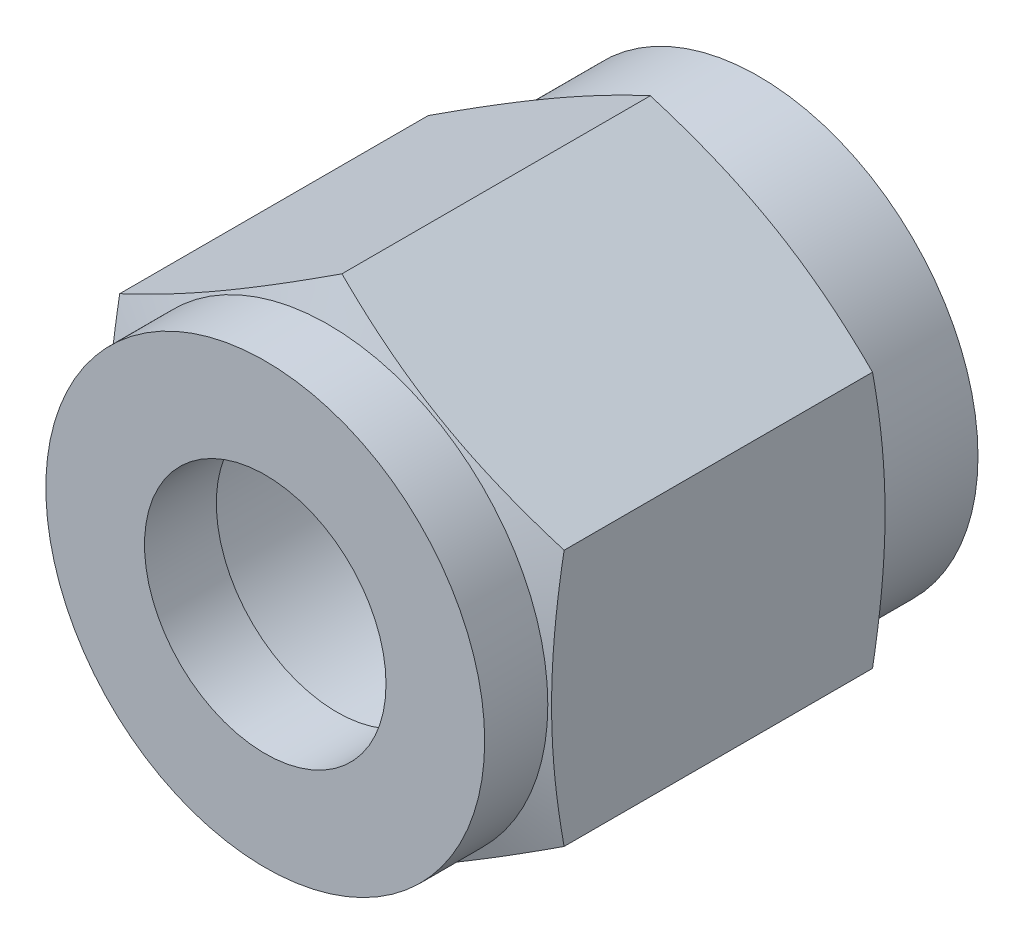
ISO-10303-21;
HEADER;
FILE_DESCRIPTION(('STEP AP214'),'2;1');
FILE_NAME('part.step','',(''),(''),'','','');
FILE_SCHEMA(('AUTOMOTIVE_DESIGN { 1 0 10303 214 1 1 1 1 }'));
ENDSEC;
DATA;
#1=APPLICATION_CONTEXT('core data for automotive mechanical design processes');
#2=APPLICATION_PROTOCOL_DEFINITION('international standard','automotive_design',2000,#1);
#3=PRODUCT_CONTEXT('',#1,'mechanical');
#4=PRODUCT('Part','Part','',(#3));
#5=PRODUCT_RELATED_PRODUCT_CATEGORY('part','',(#4));
#6=PRODUCT_DEFINITION_FORMATION('','',#4);
#7=PRODUCT_DEFINITION_CONTEXT('part definition',#1,'design');
#8=PRODUCT_DEFINITION('design','',#6,#7);
#9=PRODUCT_DEFINITION_SHAPE('','',#8);
#10=(LENGTH_UNIT() NAMED_UNIT(*) SI_UNIT(.MILLI.,.METRE.));
#11=(NAMED_UNIT(*) PLANE_ANGLE_UNIT() SI_UNIT($,.RADIAN.));
#12=(NAMED_UNIT(*) SI_UNIT($,.STERADIAN.) SOLID_ANGLE_UNIT());
#13=UNCERTAINTY_MEASURE_WITH_UNIT(LENGTH_MEASURE(1.E-05),#10,'distance_accuracy_value','');
#14=(GEOMETRIC_REPRESENTATION_CONTEXT(3) GLOBAL_UNCERTAINTY_ASSIGNED_CONTEXT((#13)) GLOBAL_UNIT_ASSIGNED_CONTEXT((#10,
#11,#12)) REPRESENTATION_CONTEXT('',''));
#15=CARTESIAN_POINT('',(0.,0.,0.));
#16=DIRECTION('',(0.,0.,1.));
#17=DIRECTION('',(1.,0.,0.));
#18=AXIS2_PLACEMENT_3D('',#15,#16,#17);
#19=CARTESIAN_POINT('',(0.,3.8862,15.875));
#20=DIRECTION('',(0.,0.,-1.));
#21=DIRECTION('',(-1.,0.,0.));
#22=AXIS2_PLACEMENT_3D('',#19,#20,#21);
#23=PLANE('',#22);
#24=CARTESIAN_POINT('',(0.,0.,15.875));
#25=DIRECTION('',(0.,0.,1.));
#26=DIRECTION('',(1.,0.,0.));
#27=AXIS2_PLACEMENT_3D('',#24,#25,#26);
#28=CIRCLE('',#27,3.8862);
#29=CARTESIAN_POINT('',(3.8862,0.,15.875));
#30=VERTEX_POINT('',#29);
#31=EDGE_CURVE('E199',#30,#30,#28,.T.);
#32=ORIENTED_EDGE('',*,*,#31,.F.);
#33=EDGE_LOOP('',(#32));
#34=FACE_BOUND('',#33,.T.);
#35=CARTESIAN_POINT('',(0.,0.,15.875));
#36=DIRECTION('',(0.,0.,1.));
#37=DIRECTION('',(1.,0.,0.));
#38=AXIS2_PLACEMENT_3D('',#35,#36,#37);
#39=CIRCLE('',#38,7.0612);
#40=CARTESIAN_POINT('',(7.0612,0.,15.875));
#41=VERTEX_POINT('',#40);
#42=EDGE_CURVE('E219',#41,#41,#39,.T.);
#43=ORIENTED_EDGE('',*,*,#42,.T.);
#44=EDGE_LOOP('',(#43));
#45=FACE_BOUND('',#44,.T.);
#46=ADVANCED_FACE('F35',(#34,#45),#23,.F.);
#47=CARTESIAN_POINT('',(0.,0.,-2.00199408661353));
#48=DIRECTION('',(0.,0.,1.));
#49=DIRECTION('',(1.,0.,0.));
#50=AXIS2_PLACEMENT_3D('',#47,#48,#49);
#51=CYLINDRICAL_SURFACE('',#50,7.0612);
#52=ORIENTED_EDGE('',*,*,#42,.F.);
#53=EDGE_LOOP('',(#52));
#54=FACE_BOUND('',#53,.T.);
#55=CARTESIAN_POINT('',(0.,0.,13.843));
#56=DIRECTION('',(0.,0.,1.));
#57=DIRECTION('',(1.,0.,0.));
#58=AXIS2_PLACEMENT_3D('',#55,#56,#57);
#59=CIRCLE('',#58,7.0612);
#60=CARTESIAN_POINT('',(7.0612,0.,13.843));
#61=VERTEX_POINT('',#60);
#62=EDGE_CURVE('E217',#61,#61,#59,.T.);
#63=ORIENTED_EDGE('',*,*,#62,.T.);
#64=EDGE_LOOP('',(#63));
#65=FACE_BOUND('',#64,.T.);
#66=ADVANCED_FACE('F246',(#54,#65),#51,.T.);
#67=CARTESIAN_POINT('',(0.,0.,12.9185156049638));
#68=DIRECTION('',(0.,0.,-1.));
#69=DIRECTION('',(-1.,0.,0.));
#70=AXIS2_PLACEMENT_3D('',#67,#68,#69);
#71=CONICAL_SURFACE('',#70,9.6012,1.22173047639603);
#72=CARTESIAN_POINT('',(7.1501,-10.9733942408285,11.6460386591749));
#73=CARTESIAN_POINT('',(7.1501,-10.6494131631028,11.744808436719));
#74=CARTESIAN_POINT('',(7.1501,-10.325077202807,11.8424352186267));
#75=CARTESIAN_POINT('',(7.1501,-9.67551472139027,12.0347705406337));
#76=CARTESIAN_POINT('',(7.1501,-9.35028813290628,12.129478852961));
#77=CARTESIAN_POINT('',(7.1501,-8.69821796772036,12.3154994404002));
#78=CARTESIAN_POINT('',(7.1501,-8.37137252117667,12.4068051844316));
#79=CARTESIAN_POINT('',(7.1501,-7.71647177269753,12.5849632056731));
#80=CARTESIAN_POINT('',(7.1501,-7.38841649230386,12.6718155617718));
#81=CARTESIAN_POINT('',(7.1501,-6.73492094013619,12.8389290922431));
#82=CARTESIAN_POINT('',(7.1501,-6.40949812330909,12.919258188514));
#83=CARTESIAN_POINT('',(7.1501,-5.7570381913487,13.0731429420443));
#84=CARTESIAN_POINT('',(7.1501,-5.43000104928173,13.1466984858874));
#85=CARTESIAN_POINT('',(7.1501,-4.77423019198395,13.2853358746407));
#86=CARTESIAN_POINT('',(7.1501,-4.44549705607634,13.3504204365588));
#87=CARTESIAN_POINT('',(7.1501,-3.78612022718696,13.4701461060986));
#88=CARTESIAN_POINT('',(7.1501,-3.45547659752591,13.5247875578208));
#89=CARTESIAN_POINT('',(7.1501,-2.82941436881223,13.6160140456905));
#90=CARTESIAN_POINT('',(7.1501,-2.53419227767363,13.6539350946488));
#91=CARTESIAN_POINT('',(7.1501,-1.94248658759804,13.7182724007931));
#92=CARTESIAN_POINT('',(7.1501,-1.64600302551776,13.7446889918084));
#93=CARTESIAN_POINT('',(7.1501,-1.05237677291001,13.7847459371043));
#94=CARTESIAN_POINT('',(7.1501,-0.755234718997437,13.7983955742554));
#95=CARTESIAN_POINT('',(7.1501,-0.160634054487782,13.8122266296512));
#96=CARTESIAN_POINT('',(7.1501,0.136824553620815,13.812408153));
#97=CARTESIAN_POINT('',(7.1501,0.732958138886146,13.799259319847));
#98=CARTESIAN_POINT('',(7.1501,1.03163156831226,13.7858599417533));
#99=CARTESIAN_POINT('',(7.1501,1.62811277408338,13.7461643986606));
#100=CARTESIAN_POINT('',(7.1501,1.9259205292876,13.7198679213172));
#101=CARTESIAN_POINT('',(7.1501,2.52052035822284,13.6556174521548));
#102=CARTESIAN_POINT('',(7.1501,2.8173113189939,13.6176533086444));
#103=CARTESIAN_POINT('',(7.1501,3.40940808663049,13.5316204835804));
#104=CARTESIAN_POINT('',(7.1501,3.7047138864032,13.4835517538162));
#105=CARTESIAN_POINT('',(7.1501,4.31312291771623,13.3754547496146));
#106=CARTESIAN_POINT('',(7.1501,4.62612259339509,13.3148487158894));
#107=CARTESIAN_POINT('',(7.1501,5.2504916881829,13.185703525963));
#108=CARTESIAN_POINT('',(7.1501,5.56186097646994,13.1171637430545));
#109=CARTESIAN_POINT('',(7.1501,6.18319904560609,12.9736301907073));
#110=CARTESIAN_POINT('',(7.1501,6.49316737054438,12.8986344600215));
#111=CARTESIAN_POINT('',(7.1501,7.11178340057605,12.743438051136));
#112=CARTESIAN_POINT('',(7.1501,7.42043113872977,12.6632375040589));
#113=CARTESIAN_POINT('',(7.1501,8.03700685953119,12.4985078030037));
#114=CARTESIAN_POINT('',(7.1501,8.3449333306404,12.4139730117113));
#115=CARTESIAN_POINT('',(7.1501,8.95981983595927,12.241452414998));
#116=CARTESIAN_POINT('',(7.1501,9.26677985561915,12.1534665578876));
#117=CARTESIAN_POINT('',(7.1501,10.1863158594963,11.885334346692));
#118=CARTESIAN_POINT('',(7.1501,10.7976644158551,11.7009816487472));
#119=CARTESIAN_POINT('',(7.1501,12.0112070605424,11.3267084330905));
#120=CARTESIAN_POINT('',(7.1501,12.6134274343107,11.1368724429872));
#121=CARTESIAN_POINT('',(7.1501,13.8161846275291,10.7518485838213));
#122=CARTESIAN_POINT('',(7.1501,14.4167213609373,10.5566604465432));
#123=CARTESIAN_POINT('',(7.1501,15.6141650513847,10.163153877372));
#124=CARTESIAN_POINT('',(7.1501,16.2110770212311,9.96485066266263));
#125=CARTESIAN_POINT('',(7.1501,17.1056879229171,9.66522189183673));
#126=CARTESIAN_POINT('',(7.1501,17.4037530959653,9.56498749155974));
#127=CARTESIAN_POINT('',(7.1501,17.9996665625431,9.36387831124216));
#128=CARTESIAN_POINT('',(7.1501,18.2975148565927,9.26300353274239));
#129=CARTESIAN_POINT('',(7.1501,18.5952690417214,9.16185177243029));
#130=B_SPLINE_CURVE_WITH_KNOTS('',3,(#72,#73,#74,#75,#76,#77,#78,#79,#80,#81,#82,#83,#84,#85,
#86,#87,#88,#89,#90,#91,#92,#93,#94,#95,#96,#97,#98,#99,#100,#101,#102,#103,#104,#105,#106,#107,
#108,#109,#110,#111,#112,#113,#114,#115,#116,#117,#118,#119,#120,#121,#122,#123,#124,#125,#126,
#127,#128,#129),.UNSPECIFIED.,.F.,.F.,(4,2,2,2,2,2,2,2,2,2,2,2,2,2,2,2,2,2,2,2,2,2,2,2,2,2,2,2,
4),(0.,1.01611381773726,2.03230673822492,3.05035906464442,4.06839335073972,5.07390804185603,
6.07943956623543,7.08464777445708,8.08982285536477,8.98257076191834,9.87529276153749,
10.7673651559618,11.6594305887146,12.5560525711153,13.4526962691479,14.3501223296068,
15.2475526719262,16.2038655914498,17.1602541042189,18.1169341897593,19.0735901834087,
20.0315236753987,20.9894715206372,22.9050046958671,24.7992733285772,26.6936370640948,
28.5805964102331,29.5239982193797,30.4673977594761),.UNSPECIFIED.);
#131=CARTESIAN_POINT('',(7.1501,-4.12811215973275,13.4080467184903));
#132=VERTEX_POINT('',#131);
#133=CARTESIAN_POINT('',(7.1501,4.12811215973275,13.4080467184903));
#134=VERTEX_POINT('',#133);
#135=EDGE_CURVE('E89',#132,#134,#130,.T.);
#136=ORIENTED_EDGE('',*,*,#135,.T.);
#137=CARTESIAN_POINT('',(7.1503,4.12799668967891,13.4080046899461));
#138=CARTESIAN_POINT('',(6.85418215778212,4.29896040559525,13.4702534607761));
#139=CARTESIAN_POINT('',(6.55708785067137,4.47048788378035,13.5268794761757));
#140=CARTESIAN_POINT('',(5.96096751027156,4.81465812277959,13.6265041708364));
#141=CARTESIAN_POINT('',(5.66194015103077,4.98730164913233,13.6694921867209));
#142=CARTESIAN_POINT('',(5.06527220336609,5.33178804933335,13.7390240642547));
#143=CARTESIAN_POINT('',(4.76764524127366,5.5036230560155,13.765719584696));
#144=CARTESIAN_POINT('',(4.1716953174409,5.84769490496389,13.8015257787858));
#145=CARTESIAN_POINT('',(3.87337265872045,6.0199315722815,13.8106430461737));
#146=CARTESIAN_POINT('',(3.27672734127955,6.36440490691673,13.8106430461737));
#147=CARTESIAN_POINT('',(2.9784046825591,6.53664157423435,13.8015257787858));
#148=CARTESIAN_POINT('',(2.38245475872634,6.88071342318273,13.765719584696));
#149=CARTESIAN_POINT('',(2.08482779663391,7.05254842986489,13.7390240642547));
#150=CARTESIAN_POINT('',(1.48815984896924,7.39703483006591,13.6694921867209));
#151=CARTESIAN_POINT('',(1.18913248972844,7.56967835641865,13.6265041708364));
#152=CARTESIAN_POINT('',(0.593012149328629,7.91384859541789,13.5268794761757));
#153=CARTESIAN_POINT('',(0.295917842217877,8.08537607360299,13.4702534607761));
#154=CARTESIAN_POINT('',(-0.000199999999998395,8.25633978951933,13.4080046899461));
#155=B_SPLINE_CURVE_WITH_KNOTS('',3,(#137,#138,#139,#140,#141,#142,#143,#144,#145,#146,#147,
#148,#149,#150,#151,#152,#153,#154),.UNSPECIFIED.,.F.,.F.,(4,2,2,2,2,2,2,2,4),(0.,
1.04275010680278,2.08631352850125,3.12000856829615,4.15331578554575,5.18662300279535,
6.22031804259025,7.26388146428872,8.3066315710915),.UNSPECIFIED.);
#156=CARTESIAN_POINT('',(0.,8.25622431946549,13.4080467184903));
#157=VERTEX_POINT('',#156);
#158=EDGE_CURVE('E191',#134,#157,#155,.T.);
#159=ORIENTED_EDGE('',*,*,#158,.T.);
#160=CARTESIAN_POINT('',(0.000200000000000909,8.25633978951933,13.4080046899461));
#161=CARTESIAN_POINT('',(-0.295917842217876,8.08537607360299,13.4702534607761));
#162=CARTESIAN_POINT('',(-0.593012149328627,7.91384859541789,13.5268794761757));
#163=CARTESIAN_POINT('',(-1.18913248972844,7.56967835641865,13.6265041708364));
#164=CARTESIAN_POINT('',(-1.48815984896923,7.39703483006591,13.6694921867209));
#165=CARTESIAN_POINT('',(-2.08482779663391,7.05254842986489,13.7390240642547));
#166=CARTESIAN_POINT('',(-2.38245475872634,6.88071342318273,13.765719584696));
#167=CARTESIAN_POINT('',(-2.9784046825591,6.53664157423435,13.8015257787858));
#168=CARTESIAN_POINT('',(-3.27672734127955,6.36440490691673,13.8106430461737));
#169=CARTESIAN_POINT('',(-3.87337265872045,6.0199315722815,13.8106430461737));
#170=CARTESIAN_POINT('',(-4.1716953174409,5.84769490496389,13.8015257787858));
#171=CARTESIAN_POINT('',(-4.76764524127366,5.5036230560155,13.765719584696));
#172=CARTESIAN_POINT('',(-5.06527220336609,5.33178804933335,13.7390240642547));
#173=CARTESIAN_POINT('',(-5.66194015103077,4.98730164913233,13.6694921867209));
#174=CARTESIAN_POINT('',(-5.96096751027156,4.81465812277959,13.6265041708364));
#175=CARTESIAN_POINT('',(-6.55708785067137,4.47048788378035,13.5268794761757));
#176=CARTESIAN_POINT('',(-6.85418215778213,4.29896040559525,13.4702534607761));
#177=CARTESIAN_POINT('',(-7.1503,4.12799668967891,13.4080046899461));
#178=B_SPLINE_CURVE_WITH_KNOTS('',3,(#160,#161,#162,#163,#164,#165,#166,#167,#168,#169,#170,
#171,#172,#173,#174,#175,#176,#177),.UNSPECIFIED.,.F.,.F.,(4,2,2,2,2,2,2,2,4),(0.,
1.04275010680278,2.08631352850125,3.12000856829615,4.15331578554575,5.18662300279536,
6.22031804259025,7.26388146428873,8.3066315710915),.UNSPECIFIED.);
#179=CARTESIAN_POINT('',(-7.1501,4.12811215973275,13.4080467184903));
#180=VERTEX_POINT('',#179);
#181=EDGE_CURVE('E185',#157,#180,#178,.T.);
#182=ORIENTED_EDGE('',*,*,#181,.T.);
#183=CARTESIAN_POINT('',(-7.1501,-10.9733942408285,11.6460386591749));
#184=CARTESIAN_POINT('',(-7.1501,-10.6494131631028,11.744808436719));
#185=CARTESIAN_POINT('',(-7.1501,-10.325077202807,11.8424352186267));
#186=CARTESIAN_POINT('',(-7.1501,-9.67551472139026,12.0347705406337));
#187=CARTESIAN_POINT('',(-7.1501,-9.35028813290628,12.129478852961));
#188=CARTESIAN_POINT('',(-7.1501,-8.69821796772036,12.3154994404002));
#189=CARTESIAN_POINT('',(-7.1501,-8.37137252117667,12.4068051844316));
#190=CARTESIAN_POINT('',(-7.1501,-7.71647177269753,12.5849632056731));
#191=CARTESIAN_POINT('',(-7.1501,-7.38841649230386,12.6718155617718));
#192=CARTESIAN_POINT('',(-7.1501,-6.73492094013619,12.8389290922431));
#193=CARTESIAN_POINT('',(-7.1501,-6.40949812330909,12.919258188514));
#194=CARTESIAN_POINT('',(-7.1501,-5.7570381913487,13.0731429420443));
#195=CARTESIAN_POINT('',(-7.1501,-5.43000104928173,13.1466984858874));
#196=CARTESIAN_POINT('',(-7.1501,-4.77423019198395,13.2853358746407));
#197=CARTESIAN_POINT('',(-7.1501,-4.44549705607634,13.3504204365588));
#198=CARTESIAN_POINT('',(-7.1501,-3.78612022718695,13.4701461060986));
#199=CARTESIAN_POINT('',(-7.1501,-3.45547659752591,13.5247875578208));
#200=CARTESIAN_POINT('',(-7.1501,-2.82941436881223,13.6160140456905));
#201=CARTESIAN_POINT('',(-7.1501,-2.53419227767363,13.6539350946488));
#202=CARTESIAN_POINT('',(-7.1501,-1.94248658759804,13.7182724007931));
#203=CARTESIAN_POINT('',(-7.1501,-1.64600302551776,13.7446889918084));
#204=CARTESIAN_POINT('',(-7.1501,-1.05237677291001,13.7847459371043));
#205=CARTESIAN_POINT('',(-7.1501,-0.755234718997436,13.7983955742554));
#206=CARTESIAN_POINT('',(-7.1501,-0.16063405448778,13.8122266296512));
#207=CARTESIAN_POINT('',(-7.1501,0.136824553620816,13.812408153));
#208=CARTESIAN_POINT('',(-7.1501,0.732958138886147,13.799259319847));
#209=CARTESIAN_POINT('',(-7.1501,1.03163156831226,13.7858599417533));
#210=CARTESIAN_POINT('',(-7.1501,1.62811277408338,13.7461643986606));
#211=CARTESIAN_POINT('',(-7.1501,1.9259205292876,13.7198679213172));
#212=CARTESIAN_POINT('',(-7.1501,2.52052035822284,13.6556174521548));
#213=CARTESIAN_POINT('',(-7.1501,2.8173113189939,13.6176533086444));
#214=CARTESIAN_POINT('',(-7.1501,3.40940808663049,13.5316204835804));
#215=CARTESIAN_POINT('',(-7.1501,3.70471388640319,13.4835517538162));
#216=CARTESIAN_POINT('',(-7.1501,4.31312291771623,13.3754547496146));
#217=CARTESIAN_POINT('',(-7.1501,4.62612259339509,13.3148487158894));
#218=CARTESIAN_POINT('',(-7.1501,5.25049168818289,13.185703525963));
#219=CARTESIAN_POINT('',(-7.1501,5.56186097646993,13.1171637430545));
#220=CARTESIAN_POINT('',(-7.1501,6.18319904560609,12.9736301907073));
#221=CARTESIAN_POINT('',(-7.1501,6.49316737054438,12.8986344600215));
#222=CARTESIAN_POINT('',(-7.1501,7.11178340057605,12.743438051136));
#223=CARTESIAN_POINT('',(-7.1501,7.42043113872976,12.6632375040589));
#224=CARTESIAN_POINT('',(-7.1501,8.03700685953119,12.4985078030037));
#225=CARTESIAN_POINT('',(-7.1501,8.34493333064039,12.4139730117113));
#226=CARTESIAN_POINT('',(-7.1501,8.95981983595926,12.241452414998));
#227=CARTESIAN_POINT('',(-7.1501,9.26677985561914,12.1534665578876));
#228=CARTESIAN_POINT('',(-7.1501,10.1863158594963,11.885334346692));
#229=CARTESIAN_POINT('',(-7.1501,10.7976644158551,11.7009816487472));
#230=CARTESIAN_POINT('',(-7.1501,12.0112070605424,11.3267084330905));
#231=CARTESIAN_POINT('',(-7.1501,12.6134274343107,11.1368724429872));
#232=CARTESIAN_POINT('',(-7.1501,13.816184627529,10.7518485838213));
#233=CARTESIAN_POINT('',(-7.1501,14.4167213609373,10.5566604465432));
#234=CARTESIAN_POINT('',(-7.1501,15.6141650513847,10.163153877372));
#235=CARTESIAN_POINT('',(-7.1501,16.2110770212311,9.96485066266263));
#236=CARTESIAN_POINT('',(-7.1501,17.1056879229171,9.66522189183673));
#237=CARTESIAN_POINT('',(-7.1501,17.4037530959653,9.56498749155974));
#238=CARTESIAN_POINT('',(-7.1501,17.9996665625431,9.36387831124216));
#239=CARTESIAN_POINT('',(-7.1501,18.2975148565927,9.26300353274239));
#240=CARTESIAN_POINT('',(-7.1501,18.5952690417214,9.16185177243029));
#241=B_SPLINE_CURVE_WITH_KNOTS('',3,(#183,#184,#185,#186,#187,#188,#189,#190,#191,#192,#193,
#194,#195,#196,#197,#198,#199,#200,#201,#202,#203,#204,#205,#206,#207,#208,#209,#210,#211,#212,
#213,#214,#215,#216,#217,#218,#219,#220,#221,#222,#223,#224,#225,#226,#227,#228,#229,#230,#231,
#232,#233,#234,#235,#236,#237,#238,#239,#240),.UNSPECIFIED.,.F.,.F.,(4,2,2,2,2,2,2,2,2,2,2,2,2,
2,2,2,2,2,2,2,2,2,2,2,2,2,2,2,4),(0.,1.01611381773726,2.03230673822492,3.05035906464442,
4.06839335073973,5.07390804185603,6.07943956623543,7.08464777445708,8.08982285536477,
8.98257076191834,9.87529276153749,10.7673651559618,11.6594305887146,12.5560525711153,
13.4526962691479,14.3501223296068,15.2475526719262,16.2038655914498,17.1602541042189,
18.1169341897593,19.0735901834087,20.0315236753987,20.9894715206372,22.9050046958671,
24.7992733285772,26.6936370640948,28.5805964102331,29.5239982193797,30.4673977594761),.UNSPECIFIED.);
#242=CARTESIAN_POINT('',(-7.1501,-4.12811215973274,13.4080467184903));
#243=VERTEX_POINT('',#242);
#244=EDGE_CURVE('E112',#180,#243,#241,.F.);
#245=ORIENTED_EDGE('',*,*,#244,.T.);
#246=CARTESIAN_POINT('',(-7.1503,-4.12799668967891,13.4080046899461));
#247=CARTESIAN_POINT('',(-6.85418215778213,-4.29896040559525,13.4702534607761));
#248=CARTESIAN_POINT('',(-6.55708785067137,-4.47048788378034,13.5268794761757));
#249=CARTESIAN_POINT('',(-5.96096751027156,-4.81465812277959,13.6265041708364));
#250=CARTESIAN_POINT('',(-5.66194015103077,-4.98730164913232,13.6694921867209));
#251=CARTESIAN_POINT('',(-5.06527220336609,-5.33178804933334,13.7390240642547));
#252=CARTESIAN_POINT('',(-4.76764524127366,-5.5036230560155,13.765719584696));
#253=CARTESIAN_POINT('',(-4.1716953174409,-5.84769490496388,13.8015257787858));
#254=CARTESIAN_POINT('',(-3.87337265872045,-6.0199315722815,13.8106430461737));
#255=CARTESIAN_POINT('',(-3.27672734127955,-6.36440490691673,13.8106430461737));
#256=CARTESIAN_POINT('',(-2.9784046825591,-6.53664157423435,13.8015257787858));
#257=CARTESIAN_POINT('',(-2.38245475872634,-6.88071342318273,13.765719584696));
#258=CARTESIAN_POINT('',(-2.08482779663391,-7.05254842986488,13.7390240642547));
#259=CARTESIAN_POINT('',(-1.48815984896924,-7.39703483006591,13.6694921867209));
#260=CARTESIAN_POINT('',(-1.18913248972844,-7.56967835641864,13.6265041708364));
#261=CARTESIAN_POINT('',(-0.593012149328631,-7.91384859541788,13.5268794761757));
#262=CARTESIAN_POINT('',(-0.295917842217879,-8.08537607360298,13.4702534607761));
#263=CARTESIAN_POINT('',(0.000199999999996369,-8.25633978951932,13.4080046899461));
#264=B_SPLINE_CURVE_WITH_KNOTS('',3,(#246,#247,#248,#249,#250,#251,#252,#253,#254,#255,#256,
#257,#258,#259,#260,#261,#262,#263),.UNSPECIFIED.,.F.,.F.,(4,2,2,2,2,2,2,2,4),(0.,
1.04275010680278,2.08631352850125,3.12000856829615,4.15331578554575,5.18662300279535,
6.22031804259025,7.26388146428872,8.3066315710915),.UNSPECIFIED.);
#265=CARTESIAN_POINT('',(0.,-8.25622431946549,13.4080467184903));
#266=VERTEX_POINT('',#265);
#267=EDGE_CURVE('E110',#243,#266,#264,.T.);
#268=ORIENTED_EDGE('',*,*,#267,.T.);
#269=CARTESIAN_POINT('',(-0.000200000000002757,-8.25633978951933,13.4080046899461));
#270=CARTESIAN_POINT('',(0.295917842217874,-8.08537607360298,13.4702534607761));
#271=CARTESIAN_POINT('',(0.593012149328625,-7.91384859541788,13.5268794761757));
#272=CARTESIAN_POINT('',(1.18913248972844,-7.56967835641864,13.6265041708364));
#273=CARTESIAN_POINT('',(1.48815984896923,-7.39703483006591,13.6694921867209));
#274=CARTESIAN_POINT('',(2.08482779663391,-7.05254842986489,13.7390240642547));
#275=CARTESIAN_POINT('',(2.38245475872634,-6.88071342318273,13.765719584696));
#276=CARTESIAN_POINT('',(2.9784046825591,-6.53664157423435,13.8015257787858));
#277=CARTESIAN_POINT('',(3.27672734127955,-6.36440490691673,13.8106430461737));
#278=CARTESIAN_POINT('',(3.87337265872045,-6.0199315722815,13.8106430461737));
#279=CARTESIAN_POINT('',(4.1716953174409,-5.84769490496388,13.8015257787858));
#280=CARTESIAN_POINT('',(4.76764524127366,-5.5036230560155,13.765719584696));
#281=CARTESIAN_POINT('',(5.06527220336609,-5.33178804933335,13.7390240642547));
#282=CARTESIAN_POINT('',(5.66194015103077,-4.98730164913233,13.6694921867209));
#283=CARTESIAN_POINT('',(5.96096751027156,-4.81465812277959,13.6265041708364));
#284=CARTESIAN_POINT('',(6.55708785067137,-4.47048788378035,13.5268794761757));
#285=CARTESIAN_POINT('',(6.85418215778212,-4.29896040559525,13.4702534607761));
#286=CARTESIAN_POINT('',(7.1503,-4.12799668967891,13.4080046899461));
#287=B_SPLINE_CURVE_WITH_KNOTS('',3,(#269,#270,#271,#272,#273,#274,#275,#276,#277,#278,#279,
#280,#281,#282,#283,#284,#285,#286),.UNSPECIFIED.,.F.,.F.,(4,2,2,2,2,2,2,2,4),(0.,
1.04275010680278,2.08631352850125,3.12000856829615,4.15331578554575,5.18662300279536,
6.22031804259025,7.26388146428872,8.3066315710915),.UNSPECIFIED.);
#288=EDGE_CURVE('E94',#266,#132,#287,.T.);
#289=ORIENTED_EDGE('',*,*,#288,.T.);
#290=EDGE_LOOP('',(#136,#159,#182,#245,#268,#289));
#291=FACE_BOUND('',#290,.T.);
#292=ORIENTED_EDGE('',*,*,#62,.F.);
#293=EDGE_LOOP('',(#292));
#294=FACE_BOUND('',#293,.T.);
#295=ADVANCED_FACE('F107',(#291,#294),#71,.T.);
#296=CARTESIAN_POINT('',(0.,0.,3.048));
#297=DIRECTION('',(0.,0.,1.));
#298=DIRECTION('',(1.,0.,0.));
#299=AXIS2_PLACEMENT_3D('',#296,#297,#298);
#300=CONICAL_SURFACE('',#299,7.0612,1.22173047639603);
#301=CARTESIAN_POINT('',(-7.1503,4.12799668967891,3.48299531005388));
#302=CARTESIAN_POINT('',(-6.85418215778213,4.29896040559525,3.42074653922392));
#303=CARTESIAN_POINT('',(-6.55708785067137,4.47048788378035,3.36412052382427));
#304=CARTESIAN_POINT('',(-5.96096751027156,4.81465812277959,3.26449582916365));
#305=CARTESIAN_POINT('',(-5.66194015103077,4.98730164913233,3.22150781327906));
#306=CARTESIAN_POINT('',(-5.06527220336609,5.33178804933335,3.15197593574528));
#307=CARTESIAN_POINT('',(-4.76764524127366,5.5036230560155,3.12528041530402));
#308=CARTESIAN_POINT('',(-4.1716953174409,5.84769490496389,3.08947422121423));
#309=CARTESIAN_POINT('',(-3.87337265872045,6.0199315722815,3.08035695382627));
#310=CARTESIAN_POINT('',(-3.27672734127955,6.36440490691673,3.08035695382627));
#311=CARTESIAN_POINT('',(-2.9784046825591,6.53664157423435,3.08947422121423));
#312=CARTESIAN_POINT('',(-2.38245475872634,6.88071342318273,3.12528041530402));
#313=CARTESIAN_POINT('',(-2.08482779663391,7.05254842986489,3.15197593574528));
#314=CARTESIAN_POINT('',(-1.48815984896923,7.39703483006591,3.22150781327906));
#315=CARTESIAN_POINT('',(-1.18913248972844,7.56967835641865,3.26449582916365));
#316=CARTESIAN_POINT('',(-0.593012149328627,7.91384859541789,3.36412052382427));
#317=CARTESIAN_POINT('',(-0.295917842217875,8.08537607360299,3.42074653922393));
#318=CARTESIAN_POINT('',(0.000200000000000868,8.25633978951933,3.48299531005388));
#319=B_SPLINE_CURVE_WITH_KNOTS('',3,(#301,#302,#303,#304,#305,#306,#307,#308,#309,#310,#311,
#312,#313,#314,#315,#316,#317,#318),.UNSPECIFIED.,.F.,.F.,(4,2,2,2,2,2,2,2,4),(0.,
1.04275010680278,2.08631352850125,3.12000856829615,4.15331578554575,5.18662300279536,
6.22031804259025,7.26388146428873,8.3066315710915),.UNSPECIFIED.);
#320=CARTESIAN_POINT('',(-7.1501,4.12811215973275,3.48295328150966));
#321=VERTEX_POINT('',#320);
#322=CARTESIAN_POINT('',(0.,8.25622431946549,3.48295328150966));
#323=VERTEX_POINT('',#322);
#324=EDGE_CURVE('E47',#321,#323,#319,.T.);
#325=ORIENTED_EDGE('',*,*,#324,.T.);
#326=CARTESIAN_POINT('',(-0.000199999999999091,8.25633978951933,3.48299531005388));
#327=CARTESIAN_POINT('',(0.295917842217877,8.08537607360299,3.42074653922392));
#328=CARTESIAN_POINT('',(0.593012149328629,7.91384859541789,3.36412052382427));
#329=CARTESIAN_POINT('',(1.18913248972844,7.56967835641865,3.26449582916365));
#330=CARTESIAN_POINT('',(1.48815984896923,7.39703483006591,3.22150781327906));
#331=CARTESIAN_POINT('',(2.08482779663391,7.05254842986489,3.15197593574528));
#332=CARTESIAN_POINT('',(2.38245475872634,6.88071342318273,3.12528041530402));
#333=CARTESIAN_POINT('',(2.9784046825591,6.53664157423435,3.08947422121423));
#334=CARTESIAN_POINT('',(3.27672734127955,6.36440490691673,3.08035695382627));
#335=CARTESIAN_POINT('',(3.87337265872045,6.0199315722815,3.08035695382627));
#336=CARTESIAN_POINT('',(4.1716953174409,5.84769490496388,3.08947422121423));
#337=CARTESIAN_POINT('',(4.76764524127366,5.5036230560155,3.12528041530402));
#338=CARTESIAN_POINT('',(5.06527220336609,5.33178804933335,3.15197593574528));
#339=CARTESIAN_POINT('',(5.66194015103077,4.98730164913233,3.22150781327906));
#340=CARTESIAN_POINT('',(5.96096751027156,4.81465812277959,3.26449582916365));
#341=CARTESIAN_POINT('',(6.55708785067137,4.47048788378035,3.36412052382427));
#342=CARTESIAN_POINT('',(6.85418215778212,4.29896040559525,3.42074653922392));
#343=CARTESIAN_POINT('',(7.1503,4.12799668967891,3.48299531005388));
#344=B_SPLINE_CURVE_WITH_KNOTS('',3,(#326,#327,#328,#329,#330,#331,#332,#333,#334,#335,#336,
#337,#338,#339,#340,#341,#342,#343),.UNSPECIFIED.,.F.,.F.,(4,2,2,2,2,2,2,2,4),(0.,
1.04275010680278,2.08631352850125,3.12000856829615,4.15331578554575,5.18662300279535,
6.22031804259025,7.26388146428872,8.3066315710915),.UNSPECIFIED.);
#345=CARTESIAN_POINT('',(7.1501,4.12811215973275,3.48295328150966));
#346=VERTEX_POINT('',#345);
#347=EDGE_CURVE('E12',#323,#346,#344,.T.);
#348=ORIENTED_EDGE('',*,*,#347,.T.);
#349=CARTESIAN_POINT('',(7.1501,-10.9733942408285,5.24496134082512));
#350=CARTESIAN_POINT('',(7.1501,-10.6494131631028,5.14619156328102));
#351=CARTESIAN_POINT('',(7.1501,-10.325077202807,5.0485647813733));
#352=CARTESIAN_POINT('',(7.1501,-9.67551472139027,4.85622945936634));
#353=CARTESIAN_POINT('',(7.1501,-9.35028813290629,4.76152114703897));
#354=CARTESIAN_POINT('',(7.1501,-8.69821796772037,4.57550055959984));
#355=CARTESIAN_POINT('',(7.1501,-8.37137252117668,4.48419481556839));
#356=CARTESIAN_POINT('',(7.1501,-7.71647177269753,4.30603679432692));
#357=CARTESIAN_POINT('',(7.1501,-7.38841649230386,4.21918443822821));
#358=CARTESIAN_POINT('',(7.1501,-6.73492094013619,4.05207090775689));
#359=CARTESIAN_POINT('',(7.1501,-6.4094981233091,3.97174181148595));
#360=CARTESIAN_POINT('',(7.1501,-5.7570381913487,3.81785705795567));
#361=CARTESIAN_POINT('',(7.1501,-5.43000104928173,3.74430151411259));
#362=CARTESIAN_POINT('',(7.1501,-4.77423019198396,3.60566412535931));
#363=CARTESIAN_POINT('',(7.1501,-4.44549705607634,3.54057956344124));
#364=CARTESIAN_POINT('',(7.1501,-3.78612022718696,3.42085389390139));
#365=CARTESIAN_POINT('',(7.1501,-3.45547659752591,3.36621244217923));
#366=CARTESIAN_POINT('',(7.1501,-2.82941436881223,3.27498595430949));
#367=CARTESIAN_POINT('',(7.1501,-2.53419227767363,3.23706490535121));
#368=CARTESIAN_POINT('',(7.1501,-1.94248658759804,3.17272759920692));
#369=CARTESIAN_POINT('',(7.1501,-1.64600302551775,3.14631100819164));
#370=CARTESIAN_POINT('',(7.1501,-1.05237677291,3.10625406289572));
#371=CARTESIAN_POINT('',(7.1501,-0.755234718997424,3.09260442574458));
#372=CARTESIAN_POINT('',(7.1501,-0.160634054487766,3.07877337034883));
#373=CARTESIAN_POINT('',(7.1501,0.136824553620833,3.078591847));
#374=CARTESIAN_POINT('',(7.1501,0.732958138886166,3.09174068015301));
#375=CARTESIAN_POINT('',(7.1501,1.03163156831228,3.10514005824669));
#376=CARTESIAN_POINT('',(7.1501,1.6281127740834,3.14483560133939));
#377=CARTESIAN_POINT('',(7.1501,1.92592052928763,3.17113207868278));
#378=CARTESIAN_POINT('',(7.1501,2.52052035822287,3.23538254784522));
#379=CARTESIAN_POINT('',(7.1501,2.81731131899393,3.27334669135565));
#380=CARTESIAN_POINT('',(7.1501,3.40940808663052,3.35937951641964));
#381=CARTESIAN_POINT('',(7.1501,3.70471388640323,3.40744824618379));
#382=CARTESIAN_POINT('',(7.1501,4.31312291771627,3.5155452503854));
#383=CARTESIAN_POINT('',(7.1501,4.62612259339513,3.57615128411064));
#384=CARTESIAN_POINT('',(7.1501,5.25049168818293,3.70529647403704));
#385=CARTESIAN_POINT('',(7.1501,5.56186097646997,3.77383625694554));
#386=CARTESIAN_POINT('',(7.1501,6.18319904560612,3.91736980929274));
#387=CARTESIAN_POINT('',(7.1501,6.49316737054441,3.99236553997849));
#388=CARTESIAN_POINT('',(7.1501,7.11178340057608,4.14756194886404));
#389=CARTESIAN_POINT('',(7.1501,7.4204311387298,4.22776249594108));
#390=CARTESIAN_POINT('',(7.1501,8.03700685953123,4.39249219699631));
#391=CARTESIAN_POINT('',(7.1501,8.34493333064043,4.47702698828873));
#392=CARTESIAN_POINT('',(7.1501,8.9598198359593,4.64954758500202));
#393=CARTESIAN_POINT('',(7.1501,9.26677985561918,4.73753344211237));
#394=CARTESIAN_POINT('',(7.1501,10.1863158594963,5.00566565330798));
#395=CARTESIAN_POINT('',(7.1501,10.7976644158552,5.19001835125276));
#396=CARTESIAN_POINT('',(7.1501,12.0112070605424,5.56429156690954));
#397=CARTESIAN_POINT('',(7.1501,12.6134274343108,5.75412755701282));
#398=CARTESIAN_POINT('',(7.1501,13.8161846275291,6.13915141617868));
#399=CARTESIAN_POINT('',(7.1501,14.4167213609373,6.33433955345683));
#400=CARTESIAN_POINT('',(7.1501,15.6141650513847,6.72784612262798));
#401=CARTESIAN_POINT('',(7.1501,16.2110770212311,6.92614933733737));
#402=CARTESIAN_POINT('',(7.1501,17.1056879229172,7.22577810816326));
#403=CARTESIAN_POINT('',(7.1501,17.4037530959654,7.32601250844025));
#404=CARTESIAN_POINT('',(7.1501,17.9996665625432,7.52712168875783));
#405=CARTESIAN_POINT('',(7.1501,18.2975148565927,7.6279964672576));
#406=CARTESIAN_POINT('',(7.1501,18.5952690417214,7.7291482275697));
#407=B_SPLINE_CURVE_WITH_KNOTS('',3,(#349,#350,#351,#352,#353,#354,#355,#356,#357,#358,#359,
#360,#361,#362,#363,#364,#365,#366,#367,#368,#369,#370,#371,#372,#373,#374,#375,#376,#377,#378,
#379,#380,#381,#382,#383,#384,#385,#386,#387,#388,#389,#390,#391,#392,#393,#394,#395,#396,#397,
#398,#399,#400,#401,#402,#403,#404,#405,#406),.UNSPECIFIED.,.F.,.F.,(4,2,2,2,2,2,2,2,2,2,2,2,2,
2,2,2,2,2,2,2,2,2,2,2,2,2,2,2,4),(0.,1.01611381773726,2.03230673822492,3.05035906464442,
4.06839335073972,5.07390804185603,6.07943956623543,7.08464777445708,8.08982285536477,
8.98257076191835,9.8752927615375,10.7673651559618,11.6594305887146,12.5560525711153,
13.4526962691479,14.3501223296068,15.2475526719262,16.2038655914498,17.160254104219,
18.1169341897593,19.0735901834088,20.0315236753988,20.9894715206373,22.9050046958671,
24.7992733285772,26.6936370640949,28.5805964102332,29.5239982193798,30.4673977594761),.UNSPECIFIED.);
#408=CARTESIAN_POINT('',(7.1501,-4.12811215973277,3.48295328150963));
#409=VERTEX_POINT('',#408);
#410=EDGE_CURVE('E144',#346,#409,#407,.F.);
#411=ORIENTED_EDGE('',*,*,#410,.T.);
#412=CARTESIAN_POINT('',(7.1503,-4.12799668967891,3.48299531005388));
#413=CARTESIAN_POINT('',(6.85418215778212,-4.29896040559525,3.42074653922392));
#414=CARTESIAN_POINT('',(6.55708785067137,-4.47048788378035,3.36412052382427));
#415=CARTESIAN_POINT('',(5.96096751027156,-4.81465812277959,3.26449582916365));
#416=CARTESIAN_POINT('',(5.66194015103077,-4.98730164913233,3.22150781327906));
#417=CARTESIAN_POINT('',(5.06527220336609,-5.33178804933335,3.15197593574528));
#418=CARTESIAN_POINT('',(4.76764524127366,-5.5036230560155,3.12528041530402));
#419=CARTESIAN_POINT('',(4.1716953174409,-5.84769490496388,3.08947422121423));
#420=CARTESIAN_POINT('',(3.87337265872045,-6.0199315722815,3.08035695382627));
#421=CARTESIAN_POINT('',(3.27672734127955,-6.36440490691673,3.08035695382627));
#422=CARTESIAN_POINT('',(2.9784046825591,-6.53664157423435,3.08947422121423));
#423=CARTESIAN_POINT('',(2.38245475872634,-6.88071342318273,3.12528041530402));
#424=CARTESIAN_POINT('',(2.08482779663391,-7.05254842986489,3.15197593574528));
#425=CARTESIAN_POINT('',(1.48815984896923,-7.39703483006591,3.22150781327906));
#426=CARTESIAN_POINT('',(1.18913248972844,-7.56967835641864,3.26449582916365));
#427=CARTESIAN_POINT('',(0.593012149328625,-7.91384859541788,3.36412052382427));
#428=CARTESIAN_POINT('',(0.295917842217873,-8.08537607360298,3.42074653922392));
#429=CARTESIAN_POINT('',(-0.000200000000004339,-8.25633978951933,3.48299531005388));
#430=B_SPLINE_CURVE_WITH_KNOTS('',3,(#412,#413,#414,#415,#416,#417,#418,#419,#420,#421,#422,
#423,#424,#425,#426,#427,#428,#429),.UNSPECIFIED.,.F.,.F.,(4,2,2,2,2,2,2,2,4),(0.,
1.04275010680278,2.08631352850125,3.12000856829615,4.15331578554575,5.18662300279536,
6.22031804259025,7.26388146428873,8.3066315710915),.UNSPECIFIED.);
#431=CARTESIAN_POINT('',(0.,-8.25622431946549,3.48295328150966));
#432=VERTEX_POINT('',#431);
#433=EDGE_CURVE('E102',#409,#432,#430,.T.);
#434=ORIENTED_EDGE('',*,*,#433,.T.);
#435=CARTESIAN_POINT('',(0.000199999999997734,-8.25633978951933,3.48299531005388));
#436=CARTESIAN_POINT('',(-0.295917842217878,-8.08537607360298,3.42074653922392));
#437=CARTESIAN_POINT('',(-0.59301214932863,-7.91384859541788,3.36412052382427));
#438=CARTESIAN_POINT('',(-1.18913248972844,-7.56967835641864,3.26449582916365));
#439=CARTESIAN_POINT('',(-1.48815984896924,-7.39703483006591,3.22150781327906));
#440=CARTESIAN_POINT('',(-2.08482779663391,-7.05254842986488,3.15197593574528));
#441=CARTESIAN_POINT('',(-2.38245475872634,-6.88071342318273,3.12528041530402));
#442=CARTESIAN_POINT('',(-2.9784046825591,-6.53664157423435,3.08947422121423));
#443=CARTESIAN_POINT('',(-3.27672734127955,-6.36440490691673,3.08035695382627));
#444=CARTESIAN_POINT('',(-3.87337265872045,-6.0199315722815,3.08035695382627));
#445=CARTESIAN_POINT('',(-4.1716953174409,-5.84769490496388,3.08947422121423));
#446=CARTESIAN_POINT('',(-4.76764524127366,-5.5036230560155,3.12528041530402));
#447=CARTESIAN_POINT('',(-5.06527220336609,-5.33178804933334,3.15197593574528));
#448=CARTESIAN_POINT('',(-5.66194015103077,-4.98730164913232,3.22150781327906));
#449=CARTESIAN_POINT('',(-5.96096751027156,-4.81465812277959,3.26449582916365));
#450=CARTESIAN_POINT('',(-6.55708785067137,-4.47048788378035,3.36412052382427));
#451=CARTESIAN_POINT('',(-6.85418215778213,-4.29896040559525,3.42074653922392));
#452=CARTESIAN_POINT('',(-7.1503,-4.12799668967891,3.48299531005388));
#453=B_SPLINE_CURVE_WITH_KNOTS('',3,(#435,#436,#437,#438,#439,#440,#441,#442,#443,#444,#445,
#446,#447,#448,#449,#450,#451,#452),.UNSPECIFIED.,.F.,.F.,(4,2,2,2,2,2,2,2,4),(0.,
1.04275010680278,2.08631352850125,3.12000856829615,4.15331578554575,5.18662300279535,
6.22031804259025,7.26388146428872,8.3066315710915),.UNSPECIFIED.);
#454=CARTESIAN_POINT('',(-7.1501,-4.12811215973274,3.48295328150966));
#455=VERTEX_POINT('',#454);
#456=EDGE_CURVE('E143',#432,#455,#453,.T.);
#457=ORIENTED_EDGE('',*,*,#456,.T.);
#458=CARTESIAN_POINT('',(-7.1501,-10.9733942408285,5.24496134082512));
#459=CARTESIAN_POINT('',(-7.1501,-10.6494131631028,5.14619156328102));
#460=CARTESIAN_POINT('',(-7.1501,-10.325077202807,5.04856478137329));
#461=CARTESIAN_POINT('',(-7.1501,-9.67551472139026,4.85622945936633));
#462=CARTESIAN_POINT('',(-7.1501,-9.35028813290628,4.76152114703896));
#463=CARTESIAN_POINT('',(-7.1501,-8.69821796772036,4.57550055959984));
#464=CARTESIAN_POINT('',(-7.1501,-8.37137252117667,4.48419481556839));
#465=CARTESIAN_POINT('',(-7.1501,-7.71647177269752,4.30603679432691));
#466=CARTESIAN_POINT('',(-7.1501,-7.38841649230385,4.21918443822821));
#467=CARTESIAN_POINT('',(-7.1501,-6.73492094013619,4.05207090775688));
#468=CARTESIAN_POINT('',(-7.1501,-6.40949812330909,3.97174181148595));
#469=CARTESIAN_POINT('',(-7.1501,-5.7570381913487,3.81785705795567));
#470=CARTESIAN_POINT('',(-7.1501,-5.43000104928173,3.74430151411258));
#471=CARTESIAN_POINT('',(-7.1501,-4.77423019198395,3.6056641253593));
#472=CARTESIAN_POINT('',(-7.1501,-4.44549705607634,3.54057956344124));
#473=CARTESIAN_POINT('',(-7.1501,-3.78612022718695,3.42085389390139));
#474=CARTESIAN_POINT('',(-7.1501,-3.45547659752591,3.36621244217923));
#475=CARTESIAN_POINT('',(-7.1501,-2.82941436881223,3.27498595430949));
#476=CARTESIAN_POINT('',(-7.1501,-2.53419227767363,3.23706490535121));
#477=CARTESIAN_POINT('',(-7.1501,-1.94248658759804,3.17272759920692));
#478=CARTESIAN_POINT('',(-7.1501,-1.64600302551775,3.14631100819164));
#479=CARTESIAN_POINT('',(-7.1501,-1.05237677291,3.10625406289572));
#480=CARTESIAN_POINT('',(-7.1501,-0.755234718997423,3.09260442574458));
#481=CARTESIAN_POINT('',(-7.1501,-0.160634054487765,3.07877337034883));
#482=CARTESIAN_POINT('',(-7.1501,0.136824553620833,3.078591847));
#483=CARTESIAN_POINT('',(-7.1501,0.732958138886166,3.09174068015301));
#484=CARTESIAN_POINT('',(-7.1501,1.03163156831228,3.10514005824669));
#485=CARTESIAN_POINT('',(-7.1501,1.6281127740834,3.14483560133939));
#486=CARTESIAN_POINT('',(-7.1501,1.92592052928763,3.17113207868278));
#487=CARTESIAN_POINT('',(-7.1501,2.52052035822287,3.23538254784522));
#488=CARTESIAN_POINT('',(-7.1501,2.81731131899393,3.27334669135565));
#489=CARTESIAN_POINT('',(-7.1501,3.40940808663052,3.35937951641964));
#490=CARTESIAN_POINT('',(-7.1501,3.70471388640323,3.40744824618379));
#491=CARTESIAN_POINT('',(-7.1501,4.31312291771627,3.51554525038541));
#492=CARTESIAN_POINT('',(-7.1501,4.62612259339513,3.57615128411064));
#493=CARTESIAN_POINT('',(-7.1501,5.25049168818293,3.70529647403704));
#494=CARTESIAN_POINT('',(-7.1501,5.56186097646997,3.77383625694554));
#495=CARTESIAN_POINT('',(-7.1501,6.18319904560613,3.91736980929275));
#496=CARTESIAN_POINT('',(-7.1501,6.49316737054442,3.99236553997849));
#497=CARTESIAN_POINT('',(-7.1501,7.11178340057608,4.14756194886404));
#498=CARTESIAN_POINT('',(-7.1501,7.4204311387298,4.22776249594108));
#499=CARTESIAN_POINT('',(-7.1501,8.03700685953123,4.39249219699631));
#500=CARTESIAN_POINT('',(-7.1501,8.34493333064043,4.47702698828873));
#501=CARTESIAN_POINT('',(-7.1501,8.95981983595931,4.64954758500202));
#502=CARTESIAN_POINT('',(-7.1501,9.26677985561918,4.73753344211237));
#503=CARTESIAN_POINT('',(-7.1501,10.1863158594963,5.00566565330798));
#504=CARTESIAN_POINT('',(-7.1501,10.7976644158552,5.19001835125276));
#505=CARTESIAN_POINT('',(-7.1501,12.0112070605424,5.56429156690955));
#506=CARTESIAN_POINT('',(-7.1501,12.6134274343108,5.75412755701282));
#507=CARTESIAN_POINT('',(-7.1501,13.8161846275291,6.13915141617869));
#508=CARTESIAN_POINT('',(-7.1501,14.4167213609373,6.33433955345683));
#509=CARTESIAN_POINT('',(-7.1501,15.6141650513847,6.72784612262798));
#510=CARTESIAN_POINT('',(-7.1501,16.2110770212311,6.92614933733737));
#511=CARTESIAN_POINT('',(-7.1501,17.1056879229172,7.22577810816326));
#512=CARTESIAN_POINT('',(-7.1501,17.4037530959654,7.32601250844025));
#513=CARTESIAN_POINT('',(-7.1501,17.9996665625432,7.52712168875783));
#514=CARTESIAN_POINT('',(-7.1501,18.2975148565927,7.6279964672576));
#515=CARTESIAN_POINT('',(-7.1501,18.5952690417214,7.7291482275697));
#516=B_SPLINE_CURVE_WITH_KNOTS('',3,(#458,#459,#460,#461,#462,#463,#464,#465,#466,#467,#468,
#469,#470,#471,#472,#473,#474,#475,#476,#477,#478,#479,#480,#481,#482,#483,#484,#485,#486,#487,
#488,#489,#490,#491,#492,#493,#494,#495,#496,#497,#498,#499,#500,#501,#502,#503,#504,#505,#506,
#507,#508,#509,#510,#511,#512,#513,#514,#515),.UNSPECIFIED.,.F.,.F.,(4,2,2,2,2,2,2,2,2,2,2,2,2,
2,2,2,2,2,2,2,2,2,2,2,2,2,2,2,4),(0.,1.01611381773726,2.03230673822492,3.05035906464442,
4.06839335073973,5.07390804185603,6.07943956623543,7.08464777445708,8.08982285536477,
8.98257076191834,9.87529276153749,10.7673651559618,11.6594305887146,12.5560525711153,
13.4526962691479,14.3501223296068,15.2475526719262,16.2038655914498,17.160254104219,
18.1169341897593,19.0735901834088,20.0315236753988,20.9894715206373,22.9050046958671,
24.7992733285772,26.6936370640949,28.5805964102332,29.5239982193798,30.4673977594761),.UNSPECIFIED.);
#517=EDGE_CURVE('E165',#455,#321,#516,.T.);
#518=ORIENTED_EDGE('',*,*,#517,.T.);
#519=EDGE_LOOP('',(#325,#348,#411,#434,#457,#518));
#520=FACE_BOUND('',#519,.T.);
#521=CARTESIAN_POINT('',(0.,0.,3.048));
#522=DIRECTION('',(0.,0.,1.));
#523=DIRECTION('',(1.,0.,0.));
#524=AXIS2_PLACEMENT_3D('',#521,#522,#523);
#525=CIRCLE('',#524,7.0612);
#526=CARTESIAN_POINT('',(7.0612,0.,3.048));
#527=VERTEX_POINT('',#526);
#528=EDGE_CURVE('E214',#527,#527,#525,.T.);
#529=ORIENTED_EDGE('',*,*,#528,.T.);
#530=EDGE_LOOP('',(#529));
#531=FACE_BOUND('',#530,.T.);
#532=ADVANCED_FACE('F153',(#520,#531),#300,.T.);
#533=CARTESIAN_POINT('',(0.,0.,-2.00199408661353));
#534=DIRECTION('',(0.,0.,1.));
#535=DIRECTION('',(1.,0.,0.));
#536=AXIS2_PLACEMENT_3D('',#533,#534,#535);
#537=CYLINDRICAL_SURFACE('',#536,7.0612);
#538=ORIENTED_EDGE('',*,*,#528,.F.);
#539=EDGE_LOOP('',(#538));
#540=FACE_BOUND('',#539,.T.);
#541=CARTESIAN_POINT('',(0.,0.,0.));
#542=DIRECTION('',(0.,0.,1.));
#543=DIRECTION('',(1.,0.,0.));
#544=AXIS2_PLACEMENT_3D('',#541,#542,#543);
#545=CIRCLE('',#544,7.0612);
#546=CARTESIAN_POINT('',(7.0612,0.,0.));
#547=VERTEX_POINT('',#546);
#548=EDGE_CURVE('E211',#547,#547,#545,.T.);
#549=ORIENTED_EDGE('',*,*,#548,.T.);
#550=EDGE_LOOP('',(#549));
#551=FACE_BOUND('',#550,.T.);
#552=ADVANCED_FACE('F157',(#540,#551),#537,.T.);
#553=CARTESIAN_POINT('',(0.,7.0612,0.));
#554=DIRECTION('',(0.,0.,1.));
#555=DIRECTION('',(1.,0.,0.));
#556=AXIS2_PLACEMENT_3D('',#553,#554,#555);
#557=PLANE('',#556);
#558=ORIENTED_EDGE('',*,*,#548,.F.);
#559=EDGE_LOOP('',(#558));
#560=FACE_BOUND('',#559,.T.);
#561=CARTESIAN_POINT('',(0.,0.,0.));
#562=DIRECTION('',(0.,0.,1.));
#563=DIRECTION('',(1.,0.,0.));
#564=AXIS2_PLACEMENT_3D('',#561,#562,#563);
#565=CIRCLE('',#564,5.0038);
#566=CARTESIAN_POINT('',(5.0038,0.,0.));
#567=VERTEX_POINT('',#566);
#568=EDGE_CURVE('E208',#567,#567,#565,.T.);
#569=ORIENTED_EDGE('',*,*,#568,.T.);
#570=EDGE_LOOP('',(#569));
#571=FACE_BOUND('',#570,.T.);
#572=ADVANCED_FACE('F268',(#560,#571),#557,.F.);
#573=CARTESIAN_POINT('',(0.,0.,-2.00199408661353));
#574=DIRECTION('',(0.,0.,1.));
#575=DIRECTION('',(1.,0.,0.));
#576=AXIS2_PLACEMENT_3D('',#573,#574,#575);
#577=CYLINDRICAL_SURFACE('',#576,5.0038);
#578=ORIENTED_EDGE('',*,*,#568,.F.);
#579=EDGE_LOOP('',(#578));
#580=FACE_BOUND('',#579,.T.);
#581=CARTESIAN_POINT('',(0.,0.,13.5636));
#582=DIRECTION('',(0.,0.,1.));
#583=DIRECTION('',(1.,0.,0.));
#584=AXIS2_PLACEMENT_3D('',#581,#582,#583);
#585=CIRCLE('',#584,5.0038);
#586=CARTESIAN_POINT('',(5.0038,0.,13.5636));
#587=VERTEX_POINT('',#586);
#588=EDGE_CURVE('E205',#587,#587,#585,.T.);
#589=ORIENTED_EDGE('',*,*,#588,.T.);
#590=EDGE_LOOP('',(#589));
#591=FACE_BOUND('',#590,.T.);
#592=ADVANCED_FACE('F262',(#580,#591),#577,.F.);
#593=CARTESIAN_POINT('',(0.,3.8862,13.5636));
#594=DIRECTION('',(0.,0.,1.));
#595=DIRECTION('',(1.,0.,0.));
#596=AXIS2_PLACEMENT_3D('',#593,#594,#595);
#597=PLANE('',#596);
#598=ORIENTED_EDGE('',*,*,#588,.F.);
#599=EDGE_LOOP('',(#598));
#600=FACE_BOUND('',#599,.T.);
#601=CARTESIAN_POINT('',(0.,0.,13.5636));
#602=DIRECTION('',(0.,0.,1.));
#603=DIRECTION('',(1.,0.,0.));
#604=AXIS2_PLACEMENT_3D('',#601,#602,#603);
#605=CIRCLE('',#604,3.8862);
#606=CARTESIAN_POINT('',(3.8862,0.,13.5636));
#607=VERTEX_POINT('',#606);
#608=EDGE_CURVE('E202',#607,#607,#605,.T.);
#609=ORIENTED_EDGE('',*,*,#608,.T.);
#610=EDGE_LOOP('',(#609));
#611=FACE_BOUND('',#610,.T.);
#612=ADVANCED_FACE('F256',(#600,#611),#597,.F.);
#613=CARTESIAN_POINT('',(0.,0.,-2.00199408661353));
#614=DIRECTION('',(0.,0.,1.));
#615=DIRECTION('',(1.,0.,0.));
#616=AXIS2_PLACEMENT_3D('',#613,#614,#615);
#617=CYLINDRICAL_SURFACE('',#616,3.8862);
#618=ORIENTED_EDGE('',*,*,#608,.F.);
#619=EDGE_LOOP('',(#618));
#620=FACE_BOUND('',#619,.T.);
#621=ORIENTED_EDGE('',*,*,#31,.T.);
#622=EDGE_LOOP('',(#621));
#623=FACE_BOUND('',#622,.T.);
#624=ADVANCED_FACE('F254',(#620,#623),#617,.F.);
#625=CARTESIAN_POINT('',(7.1501,4.12811215973275,15.875));
#626=DIRECTION('',(-0.5,-0.866025403784439,0.));
#627=DIRECTION('',(0.866025403784439,-0.5,0.));
#628=AXIS2_PLACEMENT_3D('',#625,#626,#627);
#629=PLANE('',#628);
#630=DIRECTION('',(0.,0.,-1.));
#631=VECTOR('',#630,1.);
#632=CARTESIAN_POINT('',(7.1501,4.12811215973275,15.875));
#633=LINE('',#632,#631);
#634=EDGE_CURVE('E54',#134,#346,#633,.T.);
#635=ORIENTED_EDGE('',*,*,#634,.T.);
#636=ORIENTED_EDGE('',*,*,#347,.F.);
#637=DIRECTION('',(0.,0.,-1.));
#638=VECTOR('',#637,1.);
#639=CARTESIAN_POINT('',(0.,8.25622431946549,15.875));
#640=LINE('',#639,#638);
#641=EDGE_CURVE('E95',#157,#323,#640,.T.);
#642=ORIENTED_EDGE('',*,*,#641,.F.);
#643=ORIENTED_EDGE('',*,*,#158,.F.);
#644=EDGE_LOOP('',(#635,#636,#642,#643));
#645=FACE_BOUND('',#644,.T.);
#646=ADVANCED_FACE('F178',(#645),#629,.F.);
#647=CARTESIAN_POINT('',(0.,8.25622431946549,15.875));
#648=DIRECTION('',(0.5,-0.866025403784439,0.));
#649=DIRECTION('',(0.866025403784439,0.5,0.));
#650=AXIS2_PLACEMENT_3D('',#647,#648,#649);
#651=PLANE('',#650);
#652=ORIENTED_EDGE('',*,*,#641,.T.);
#653=ORIENTED_EDGE('',*,*,#324,.F.);
#654=DIRECTION('',(0.,0.,-1.));
#655=VECTOR('',#654,1.);
#656=CARTESIAN_POINT('',(-7.1501,4.12811215973275,15.875));
#657=LINE('',#656,#655);
#658=EDGE_CURVE('E234',#180,#321,#657,.T.);
#659=ORIENTED_EDGE('',*,*,#658,.F.);
#660=ORIENTED_EDGE('',*,*,#181,.F.);
#661=EDGE_LOOP('',(#652,#653,#659,#660));
#662=FACE_BOUND('',#661,.T.);
#663=ADVANCED_FACE('F174',(#662),#651,.F.);
#664=CARTESIAN_POINT('',(-7.1501,4.12811215973275,15.875));
#665=DIRECTION('',(1.,0.,0.));
#666=DIRECTION('',(0.,1.,0.));
#667=AXIS2_PLACEMENT_3D('',#664,#665,#666);
#668=PLANE('',#667);
#669=ORIENTED_EDGE('',*,*,#658,.T.);
#670=ORIENTED_EDGE('',*,*,#517,.F.);
#671=DIRECTION('',(0.,0.,-1.));
#672=VECTOR('',#671,1.);
#673=CARTESIAN_POINT('',(-7.1501,-4.12811215973274,15.875));
#674=LINE('',#673,#672);
#675=EDGE_CURVE('E231',#243,#455,#674,.T.);
#676=ORIENTED_EDGE('',*,*,#675,.F.);
#677=ORIENTED_EDGE('',*,*,#244,.F.);
#678=EDGE_LOOP('',(#669,#670,#676,#677));
#679=FACE_BOUND('',#678,.T.);
#680=ADVANCED_FACE('F177',(#679),#668,.F.);
#681=CARTESIAN_POINT('',(-7.1501,-4.12811215973274,15.875));
#682=DIRECTION('',(0.5,0.866025403784439,0.));
#683=DIRECTION('',(-0.866025403784439,0.5,0.));
#684=AXIS2_PLACEMENT_3D('',#681,#682,#683);
#685=PLANE('',#684);
#686=ORIENTED_EDGE('',*,*,#675,.T.);
#687=ORIENTED_EDGE('',*,*,#456,.F.);
#688=DIRECTION('',(0.,0.,-1.));
#689=VECTOR('',#688,1.);
#690=CARTESIAN_POINT('',(0.,-8.25622431946549,15.875));
#691=LINE('',#690,#689);
#692=EDGE_CURVE('E104',#266,#432,#691,.T.);
#693=ORIENTED_EDGE('',*,*,#692,.F.);
#694=ORIENTED_EDGE('',*,*,#267,.F.);
#695=EDGE_LOOP('',(#686,#687,#693,#694));
#696=FACE_BOUND('',#695,.T.);
#697=ADVANCED_FACE('F132',(#696),#685,.F.);
#698=CARTESIAN_POINT('',(0.,-8.25622431946549,15.875));
#699=DIRECTION('',(-0.5,0.866025403784439,0.));
#700=DIRECTION('',(-0.866025403784439,-0.5,0.));
#701=AXIS2_PLACEMENT_3D('',#698,#699,#700);
#702=PLANE('',#701);
#703=ORIENTED_EDGE('',*,*,#692,.T.);
#704=ORIENTED_EDGE('',*,*,#433,.F.);
#705=DIRECTION('',(0.,0.,-1.));
#706=VECTOR('',#705,1.);
#707=CARTESIAN_POINT('',(7.1501,-4.12811215973275,15.875));
#708=LINE('',#707,#706);
#709=EDGE_CURVE('E59',#132,#409,#708,.T.);
#710=ORIENTED_EDGE('',*,*,#709,.F.);
#711=ORIENTED_EDGE('',*,*,#288,.F.);
#712=EDGE_LOOP('',(#703,#704,#710,#711));
#713=FACE_BOUND('',#712,.T.);
#714=ADVANCED_FACE('F99',(#713),#702,.F.);
#715=CARTESIAN_POINT('',(7.1501,-4.12811215973275,15.875));
#716=DIRECTION('',(-1.,0.,0.));
#717=DIRECTION('',(0.,-1.,0.));
#718=AXIS2_PLACEMENT_3D('',#715,#716,#717);
#719=PLANE('',#718);
#720=ORIENTED_EDGE('',*,*,#709,.T.);
#721=ORIENTED_EDGE('',*,*,#410,.F.);
#722=ORIENTED_EDGE('',*,*,#634,.F.);
#723=ORIENTED_EDGE('',*,*,#135,.F.);
#724=EDGE_LOOP('',(#720,#721,#722,#723));
#725=FACE_BOUND('',#724,.T.);
#726=ADVANCED_FACE('F90',(#725),#719,.F.);
#727=CLOSED_SHELL('',(#46,#66,#295,#532,#552,#572,#592,#612,#624,#646,#663,#680,#697,#714,#726));
#728=MANIFOLD_SOLID_BREP('B2',#727);
#729=ADVANCED_BREP_SHAPE_REPRESENTATION('',(#18,#728),#14);
#730=SHAPE_DEFINITION_REPRESENTATION(#9,#729);
ENDSEC;
END-ISO-10303-21;
